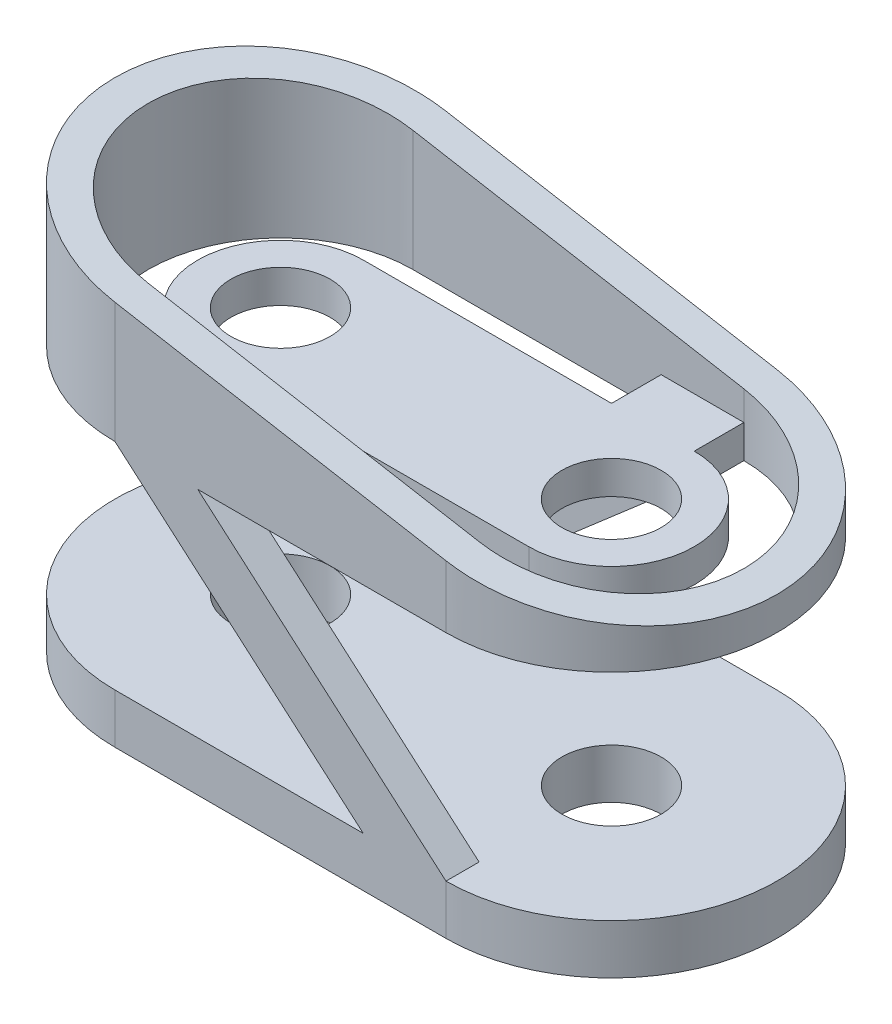
ISO-10303-21;
HEADER;
FILE_DESCRIPTION(('STEP AP214'),'2;1');
FILE_NAME('part.step','',(''),(''),'','','');
FILE_SCHEMA(('AUTOMOTIVE_DESIGN { 1 0 10303 214 1 1 1 1 }'));
ENDSEC;
DATA;
#1=APPLICATION_CONTEXT('core data for automotive mechanical design processes');
#2=APPLICATION_PROTOCOL_DEFINITION('international standard','automotive_design',2000,#1);
#3=PRODUCT_CONTEXT('',#1,'mechanical');
#4=PRODUCT('Part','Part','',(#3));
#5=PRODUCT_RELATED_PRODUCT_CATEGORY('part','',(#4));
#6=PRODUCT_DEFINITION_FORMATION('','',#4);
#7=PRODUCT_DEFINITION_CONTEXT('part definition',#1,'design');
#8=PRODUCT_DEFINITION('design','',#6,#7);
#9=PRODUCT_DEFINITION_SHAPE('','',#8);
#10=(LENGTH_UNIT() NAMED_UNIT(*) SI_UNIT(.MILLI.,.METRE.));
#11=(NAMED_UNIT(*) PLANE_ANGLE_UNIT() SI_UNIT($,.RADIAN.));
#12=(NAMED_UNIT(*) SI_UNIT($,.STERADIAN.) SOLID_ANGLE_UNIT());
#13=UNCERTAINTY_MEASURE_WITH_UNIT(LENGTH_MEASURE(1.E-05),#10,'distance_accuracy_value','');
#14=(GEOMETRIC_REPRESENTATION_CONTEXT(3) GLOBAL_UNCERTAINTY_ASSIGNED_CONTEXT((#13)) GLOBAL_UNIT_ASSIGNED_CONTEXT((#10,
#11,#12)) REPRESENTATION_CONTEXT('',''));
#15=CARTESIAN_POINT('',(0.,0.,0.));
#16=DIRECTION('',(0.,0.,1.));
#17=DIRECTION('',(1.,0.,0.));
#18=AXIS2_PLACEMENT_3D('',#15,#16,#17);
#19=CARTESIAN_POINT('',(-50.,80.,0.));
#20=DIRECTION('',(0.,1.,0.));
#21=DIRECTION('',(0.,0.,1.));
#22=AXIS2_PLACEMENT_3D('',#19,#20,#21);
#23=PLANE('',#22);
#24=CARTESIAN_POINT('',(-50.,80.,0.));
#25=DIRECTION('',(0.,-1.,0.));
#26=DIRECTION('',(0.,0.,-1.));
#27=AXIS2_PLACEMENT_3D('',#24,#25,#26);
#28=CIRCLE('',#27,40.);
#29=CARTESIAN_POINT('',(-50.,80.,40.));
#30=VERTEX_POINT('',#29);
#31=CARTESIAN_POINT('',(-50.,80.,-40.));
#32=VERTEX_POINT('',#31);
#33=EDGE_CURVE('E266',#30,#32,#28,.T.);
#34=ORIENTED_EDGE('',*,*,#33,.F.);
#35=DIRECTION('',(0.,0.,1.));
#36=VECTOR('',#35,1.);
#37=CARTESIAN_POINT('',(-50.,80.,40.));
#38=LINE('',#37,#36);
#39=CARTESIAN_POINT('',(-50.,80.,50.));
#40=VERTEX_POINT('',#39);
#41=EDGE_CURVE('E228',#30,#40,#38,.T.);
#42=ORIENTED_EDGE('',*,*,#41,.T.);
#43=CARTESIAN_POINT('',(-50.,80.,0.));
#44=DIRECTION('',(0.,1.,0.));
#45=DIRECTION('',(0.,0.,1.));
#46=AXIS2_PLACEMENT_3D('',#43,#44,#45);
#47=CIRCLE('',#46,50.);
#48=CARTESIAN_POINT('',(-50.,80.,-50.));
#49=VERTEX_POINT('',#48);
#50=EDGE_CURVE('E307',#49,#40,#47,.T.);
#51=ORIENTED_EDGE('',*,*,#50,.F.);
#52=DIRECTION('',(1.,0.,0.));
#53=VECTOR('',#52,1.);
#54=CARTESIAN_POINT('',(-50.,80.,-50.));
#55=LINE('',#54,#53);
#56=CARTESIAN_POINT('',(25.,80.,-50.));
#57=VERTEX_POINT('',#56);
#58=EDGE_CURVE('E314',#49,#57,#55,.T.);
#59=ORIENTED_EDGE('',*,*,#58,.T.);
#60=DIRECTION('',(0.,0.,-1.));
#61=VECTOR('',#60,1.);
#62=CARTESIAN_POINT('',(25.,80.,-40.));
#63=LINE('',#62,#61);
#64=CARTESIAN_POINT('',(25.,80.,-40.));
#65=VERTEX_POINT('',#64);
#66=EDGE_CURVE('E368',#65,#57,#63,.T.);
#67=ORIENTED_EDGE('',*,*,#66,.F.);
#68=DIRECTION('',(1.,0.,0.));
#69=VECTOR('',#68,1.);
#70=CARTESIAN_POINT('',(-50.,80.,-40.));
#71=LINE('',#70,#69);
#72=EDGE_CURVE('E286',#32,#65,#71,.T.);
#73=ORIENTED_EDGE('',*,*,#72,.F.);
#74=EDGE_LOOP('',(#34,#42,#51,#59,#67,#73));
#75=FACE_BOUND('',#74,.T.);
#76=ADVANCED_FACE('F33',(#75),#23,.F.);
#77=CARTESIAN_POINT('',(50.,80.,0.));
#78=DIRECTION('',(0.,-1.,0.));
#79=DIRECTION('',(0.,0.,-1.));
#80=AXIS2_PLACEMENT_3D('',#77,#78,#79);
#81=CIRCLE('',#80,15.);
#82=CARTESIAN_POINT('',(50.,80.,-15.));
#83=VERTEX_POINT('',#82);
#84=EDGE_CURVE('E490',#83,#83,#81,.T.);
#85=ORIENTED_EDGE('',*,*,#84,.F.);
#86=EDGE_LOOP('',(#85));
#87=FACE_BOUND('',#86,.T.);
#88=CARTESIAN_POINT('',(-50.,80.,0.));
#89=DIRECTION('',(0.,-1.,0.));
#90=DIRECTION('',(0.,0.,-1.));
#91=AXIS2_PLACEMENT_3D('',#88,#89,#90);
#92=CIRCLE('',#91,15.);
#93=CARTESIAN_POINT('',(-50.,80.,-15.));
#94=VERTEX_POINT('',#93);
#95=EDGE_CURVE('E484',#94,#94,#92,.T.);
#96=ORIENTED_EDGE('',*,*,#95,.F.);
#97=EDGE_LOOP('',(#96));
#98=FACE_BOUND('',#97,.T.);
#99=DIRECTION('',(-1.,0.,0.));
#100=VECTOR('',#99,1.);
#101=CARTESIAN_POINT('',(-25.,80.,40.));
#102=LINE('',#101,#100);
#103=CARTESIAN_POINT('',(-25.,80.,40.));
#104=VERTEX_POINT('',#103);
#105=EDGE_CURVE('E200',#104,#30,#102,.T.);
#106=ORIENTED_EDGE('',*,*,#105,.T.);
#107=DIRECTION('',(0.,0.,-1.));
#108=VECTOR('',#107,1.);
#109=CARTESIAN_POINT('',(-50.,80.,25.));
#110=LINE('',#109,#108);
#111=CARTESIAN_POINT('',(-50.,80.,25.));
#112=VERTEX_POINT('',#111);
#113=EDGE_CURVE('E256',#30,#112,#110,.T.);
#114=ORIENTED_EDGE('',*,*,#113,.T.);
#115=CARTESIAN_POINT('',(-50.,80.,0.));
#116=DIRECTION('',(0.,-1.,0.));
#117=DIRECTION('',(0.,0.,-1.));
#118=AXIS2_PLACEMENT_3D('',#115,#116,#117);
#119=CIRCLE('',#118,25.);
#120=CARTESIAN_POINT('',(-50.,80.,-25.));
#121=VERTEX_POINT('',#120);
#122=EDGE_CURVE('E457',#112,#121,#119,.T.);
#123=ORIENTED_EDGE('',*,*,#122,.T.);
#124=DIRECTION('',(1.,0.,0.));
#125=VECTOR('',#124,1.);
#126=CARTESIAN_POINT('',(-50.,80.,-25.));
#127=LINE('',#126,#125);
#128=CARTESIAN_POINT('',(25.,80.,-25.));
#129=VERTEX_POINT('',#128);
#130=EDGE_CURVE('E453',#121,#129,#127,.T.);
#131=ORIENTED_EDGE('',*,*,#130,.T.);
#132=DIRECTION('',(0.,0.,-1.));
#133=VECTOR('',#132,1.);
#134=CARTESIAN_POINT('',(25.,80.,-40.));
#135=LINE('',#134,#133);
#136=EDGE_CURVE('E442',#129,#65,#135,.T.);
#137=ORIENTED_EDGE('',*,*,#136,.T.);
#138=DIRECTION('',(1.,0.,0.));
#139=VECTOR('',#138,1.);
#140=CARTESIAN_POINT('',(25.,80.,-40.));
#141=LINE('',#140,#139);
#142=CARTESIAN_POINT('',(50.,80.,-40.));
#143=VERTEX_POINT('',#142);
#144=EDGE_CURVE('E351',#65,#143,#141,.T.);
#145=ORIENTED_EDGE('',*,*,#144,.T.);
#146=DIRECTION('',(0.,0.,1.));
#147=VECTOR('',#146,1.);
#148=CARTESIAN_POINT('',(50.,80.,-25.));
#149=LINE('',#148,#147);
#150=CARTESIAN_POINT('',(50.,80.,-25.));
#151=VERTEX_POINT('',#150);
#152=EDGE_CURVE('E439',#143,#151,#149,.T.);
#153=ORIENTED_EDGE('',*,*,#152,.T.);
#154=CARTESIAN_POINT('',(50.,80.,0.));
#155=DIRECTION('',(0.,-1.,0.));
#156=DIRECTION('',(0.,0.,-1.));
#157=AXIS2_PLACEMENT_3D('',#154,#155,#156);
#158=CIRCLE('',#157,25.);
#159=CARTESIAN_POINT('',(50.,80.,25.));
#160=VERTEX_POINT('',#159);
#161=EDGE_CURVE('E260',#151,#160,#158,.T.);
#162=ORIENTED_EDGE('',*,*,#161,.T.);
#163=DIRECTION('',(-1.,0.,0.));
#164=VECTOR('',#163,1.);
#165=CARTESIAN_POINT('',(-25.,80.,25.));
#166=LINE('',#165,#164);
#167=CARTESIAN_POINT('',(-25.,80.,25.));
#168=VERTEX_POINT('',#167);
#169=EDGE_CURVE('E255',#160,#168,#166,.T.);
#170=ORIENTED_EDGE('',*,*,#169,.T.);
#171=DIRECTION('',(0.,0.,1.));
#172=VECTOR('',#171,1.);
#173=CARTESIAN_POINT('',(-25.,80.,40.));
#174=LINE('',#173,#172);
#175=EDGE_CURVE('E245',#168,#104,#174,.T.);
#176=ORIENTED_EDGE('',*,*,#175,.T.);
#177=EDGE_LOOP('',(#106,#114,#123,#131,#137,#145,#153,#162,#170,#176));
#178=FACE_BOUND('',#177,.T.);
#179=ADVANCED_FACE('F252',(#87,#98,#178),#23,.F.);
#180=CARTESIAN_POINT('',(-50.,15.,0.));
#181=DIRECTION('',(0.,1.,0.));
#182=DIRECTION('',(0.,0.,1.));
#183=AXIS2_PLACEMENT_3D('',#180,#181,#182);
#184=PLANE('',#183);
#185=DIRECTION('',(0.,0.,1.));
#186=VECTOR('',#185,1.);
#187=CARTESIAN_POINT('',(25.,15.,40.));
#188=LINE('',#187,#186);
#189=CARTESIAN_POINT('',(25.,15.,40.));
#190=VERTEX_POINT('',#189);
#191=CARTESIAN_POINT('',(25.,15.,50.));
#192=VERTEX_POINT('',#191);
#193=EDGE_CURVE('E53',#190,#192,#188,.T.);
#194=ORIENTED_EDGE('',*,*,#193,.F.);
#195=DIRECTION('',(1.,0.,0.));
#196=VECTOR('',#195,1.);
#197=CARTESIAN_POINT('',(25.,15.,40.));
#198=LINE('',#197,#196);
#199=CARTESIAN_POINT('',(50.,15.,40.));
#200=VERTEX_POINT('',#199);
#201=EDGE_CURVE('E48',#190,#200,#198,.T.);
#202=ORIENTED_EDGE('',*,*,#201,.T.);
#203=DIRECTION('',(0.,0.,1.));
#204=VECTOR('',#203,1.);
#205=CARTESIAN_POINT('',(50.,15.,40.));
#206=LINE('',#205,#204);
#207=CARTESIAN_POINT('',(50.,15.,50.));
#208=VERTEX_POINT('',#207);
#209=EDGE_CURVE('E218',#200,#208,#206,.T.);
#210=ORIENTED_EDGE('',*,*,#209,.T.);
#211=CARTESIAN_POINT('',(50.,15.,0.));
#212=DIRECTION('',(0.,1.,0.));
#213=DIRECTION('',(0.,0.,1.));
#214=AXIS2_PLACEMENT_3D('',#211,#212,#213);
#215=CIRCLE('',#214,50.);
#216=CARTESIAN_POINT('',(50.,15.,-50.));
#217=VERTEX_POINT('',#216);
#218=EDGE_CURVE('E390',#208,#217,#215,.T.);
#219=ORIENTED_EDGE('',*,*,#218,.T.);
#220=DIRECTION('',(-1.,0.,0.));
#221=VECTOR('',#220,1.);
#222=CARTESIAN_POINT('',(-50.,15.,-50.));
#223=LINE('',#222,#221);
#224=CARTESIAN_POINT('',(-25.,15.,-50.));
#225=VERTEX_POINT('',#224);
#226=EDGE_CURVE('E392',#217,#225,#223,.T.);
#227=ORIENTED_EDGE('',*,*,#226,.T.);
#228=DIRECTION('',(0.,0.,-1.));
#229=VECTOR('',#228,1.);
#230=CARTESIAN_POINT('',(-25.,15.,-40.));
#231=LINE('',#230,#229);
#232=CARTESIAN_POINT('',(-25.,15.,-40.));
#233=VERTEX_POINT('',#232);
#234=EDGE_CURVE('E362',#233,#225,#231,.T.);
#235=ORIENTED_EDGE('',*,*,#234,.F.);
#236=DIRECTION('',(-1.,0.,0.));
#237=VECTOR('',#236,1.);
#238=CARTESIAN_POINT('',(-25.,15.,-40.));
#239=LINE('',#238,#237);
#240=CARTESIAN_POINT('',(-50.,15.,-40.));
#241=VERTEX_POINT('',#240);
#242=EDGE_CURVE('E344',#233,#241,#239,.T.);
#243=ORIENTED_EDGE('',*,*,#242,.T.);
#244=DIRECTION('',(0.,0.,-1.));
#245=VECTOR('',#244,1.);
#246=CARTESIAN_POINT('',(-50.,15.,-40.));
#247=LINE('',#246,#245);
#248=CARTESIAN_POINT('',(-50.,15.,-50.));
#249=VERTEX_POINT('',#248);
#250=EDGE_CURVE('E357',#241,#249,#247,.T.);
#251=ORIENTED_EDGE('',*,*,#250,.T.);
#252=CARTESIAN_POINT('',(-50.,15.,0.));
#253=DIRECTION('',(0.,1.,0.));
#254=DIRECTION('',(0.,0.,1.));
#255=AXIS2_PLACEMENT_3D('',#252,#253,#254);
#256=CIRCLE('',#255,50.);
#257=CARTESIAN_POINT('',(-50.,15.,50.));
#258=VERTEX_POINT('',#257);
#259=EDGE_CURVE('E384',#249,#258,#256,.T.);
#260=ORIENTED_EDGE('',*,*,#259,.T.);
#261=DIRECTION('',(1.,0.,0.));
#262=VECTOR('',#261,1.);
#263=CARTESIAN_POINT('',(-50.,15.,50.));
#264=LINE('',#263,#262);
#265=EDGE_CURVE('E387',#258,#192,#264,.T.);
#266=ORIENTED_EDGE('',*,*,#265,.T.);
#267=EDGE_LOOP('',(#194,#202,#210,#219,#227,#235,#243,#251,#260,#266));
#268=FACE_BOUND('',#267,.T.);
#269=CARTESIAN_POINT('',(-50.,15.,0.));
#270=DIRECTION('',(0.,1.,0.));
#271=DIRECTION('',(0.,0.,1.));
#272=AXIS2_PLACEMENT_3D('',#269,#270,#271);
#273=CIRCLE('',#272,15.);
#274=CARTESIAN_POINT('',(-50.,15.,15.));
#275=VERTEX_POINT('',#274);
#276=EDGE_CURVE('E378',#275,#275,#273,.T.);
#277=ORIENTED_EDGE('',*,*,#276,.F.);
#278=EDGE_LOOP('',(#277));
#279=FACE_BOUND('',#278,.T.);
#280=CARTESIAN_POINT('',(50.,15.,0.));
#281=DIRECTION('',(0.,1.,0.));
#282=DIRECTION('',(0.,0.,1.));
#283=AXIS2_PLACEMENT_3D('',#280,#281,#282);
#284=CIRCLE('',#283,15.);
#285=CARTESIAN_POINT('',(50.,15.,15.));
#286=VERTEX_POINT('',#285);
#287=EDGE_CURVE('E372',#286,#286,#284,.T.);
#288=ORIENTED_EDGE('',*,*,#287,.F.);
#289=EDGE_LOOP('',(#288));
#290=FACE_BOUND('',#289,.T.);
#291=ADVANCED_FACE('F426',(#268,#279,#290),#184,.T.);
#292=CARTESIAN_POINT('',(-50.,0.,0.));
#293=DIRECTION('',(0.,1.,0.));
#294=DIRECTION('',(0.,0.,1.));
#295=AXIS2_PLACEMENT_3D('',#292,#293,#294);
#296=PLANE('',#295);
#297=CARTESIAN_POINT('',(-50.,0.,0.));
#298=DIRECTION('',(0.,1.,0.));
#299=DIRECTION('',(0.,0.,1.));
#300=AXIS2_PLACEMENT_3D('',#297,#298,#299);
#301=CIRCLE('',#300,50.);
#302=CARTESIAN_POINT('',(-50.,0.,-50.));
#303=VERTEX_POINT('',#302);
#304=CARTESIAN_POINT('',(-50.,0.,50.));
#305=VERTEX_POINT('',#304);
#306=EDGE_CURVE('E381',#303,#305,#301,.T.);
#307=ORIENTED_EDGE('',*,*,#306,.F.);
#308=DIRECTION('',(-1.,0.,0.));
#309=VECTOR('',#308,1.);
#310=CARTESIAN_POINT('',(-50.,0.,-50.));
#311=LINE('',#310,#309);
#312=CARTESIAN_POINT('',(50.,0.,-50.));
#313=VERTEX_POINT('',#312);
#314=EDGE_CURVE('E388',#313,#303,#311,.T.);
#315=ORIENTED_EDGE('',*,*,#314,.F.);
#316=CARTESIAN_POINT('',(50.,0.,0.));
#317=DIRECTION('',(0.,1.,0.));
#318=DIRECTION('',(0.,0.,1.));
#319=AXIS2_PLACEMENT_3D('',#316,#317,#318);
#320=CIRCLE('',#319,50.);
#321=CARTESIAN_POINT('',(50.,0.,50.));
#322=VERTEX_POINT('',#321);
#323=EDGE_CURVE('E400',#322,#313,#320,.T.);
#324=ORIENTED_EDGE('',*,*,#323,.F.);
#325=DIRECTION('',(1.,0.,0.));
#326=VECTOR('',#325,1.);
#327=CARTESIAN_POINT('',(-50.,0.,50.));
#328=LINE('',#327,#326);
#329=EDGE_CURVE('E398',#305,#322,#328,.T.);
#330=ORIENTED_EDGE('',*,*,#329,.F.);
#331=EDGE_LOOP('',(#307,#315,#324,#330));
#332=FACE_BOUND('',#331,.T.);
#333=CARTESIAN_POINT('',(-50.,0.,0.));
#334=DIRECTION('',(0.,1.,0.));
#335=DIRECTION('',(0.,0.,1.));
#336=AXIS2_PLACEMENT_3D('',#333,#334,#335);
#337=CIRCLE('',#336,15.);
#338=CARTESIAN_POINT('',(-50.,0.,15.));
#339=VERTEX_POINT('',#338);
#340=EDGE_CURVE('E375',#339,#339,#337,.T.);
#341=ORIENTED_EDGE('',*,*,#340,.T.);
#342=EDGE_LOOP('',(#341));
#343=FACE_BOUND('',#342,.T.);
#344=CARTESIAN_POINT('',(50.,0.,0.));
#345=DIRECTION('',(0.,1.,0.));
#346=DIRECTION('',(0.,0.,1.));
#347=AXIS2_PLACEMENT_3D('',#344,#345,#346);
#348=CIRCLE('',#347,15.);
#349=CARTESIAN_POINT('',(50.,0.,15.));
#350=VERTEX_POINT('',#349);
#351=EDGE_CURVE('E364',#350,#350,#348,.T.);
#352=ORIENTED_EDGE('',*,*,#351,.T.);
#353=EDGE_LOOP('',(#352));
#354=FACE_BOUND('',#353,.T.);
#355=ADVANCED_FACE('F417',(#332,#343,#354),#296,.F.);
#356=CARTESIAN_POINT('',(-50.,15.,0.));
#357=DIRECTION('',(0.,-1.,0.));
#358=DIRECTION('',(0.,0.,-1.));
#359=AXIS2_PLACEMENT_3D('',#356,#357,#358);
#360=CYLINDRICAL_SURFACE('',#359,50.);
#361=ORIENTED_EDGE('',*,*,#306,.T.);
#362=DIRECTION('',(0.,-1.,0.));
#363=VECTOR('',#362,1.);
#364=CARTESIAN_POINT('',(-50.,15.,50.));
#365=LINE('',#364,#363);
#366=EDGE_CURVE('E11',#258,#305,#365,.T.);
#367=ORIENTED_EDGE('',*,*,#366,.F.);
#368=ORIENTED_EDGE('',*,*,#259,.F.);
#369=DIRECTION('',(0.,-1.,0.));
#370=VECTOR('',#369,1.);
#371=CARTESIAN_POINT('',(-50.,15.,-50.));
#372=LINE('',#371,#370);
#373=EDGE_CURVE('E395',#249,#303,#372,.T.);
#374=ORIENTED_EDGE('',*,*,#373,.T.);
#375=EDGE_LOOP('',(#361,#367,#368,#374));
#376=FACE_BOUND('',#375,.T.);
#377=ADVANCED_FACE('F35',(#376),#360,.T.);
#378=CARTESIAN_POINT('',(-50.,15.,50.));
#379=DIRECTION('',(0.,0.,-1.));
#380=DIRECTION('',(-1.,0.,0.));
#381=AXIS2_PLACEMENT_3D('',#378,#379,#380);
#382=PLANE('',#381);
#383=ORIENTED_EDGE('',*,*,#329,.T.);
#384=DIRECTION('',(0.,-1.,0.));
#385=VECTOR('',#384,1.);
#386=CARTESIAN_POINT('',(50.,15.,50.));
#387=LINE('',#386,#385);
#388=EDGE_CURVE('E41',#208,#322,#387,.T.);
#389=ORIENTED_EDGE('',*,*,#388,.F.);
#390=DIRECTION('',(-0.755689082789818,0.654930538417842,0.));
#391=VECTOR('',#390,1.);
#392=CARTESIAN_POINT('',(50.,15.,50.));
#393=LINE('',#392,#391);
#394=CARTESIAN_POINT('',(-25.,80.,50.));
#395=VERTEX_POINT('',#394);
#396=EDGE_CURVE('E502',#208,#395,#393,.T.);
#397=ORIENTED_EDGE('',*,*,#396,.T.);
#398=DIRECTION('',(1.,0.,0.));
#399=VECTOR('',#398,1.);
#400=CARTESIAN_POINT('',(-50.,80.,50.));
#401=LINE('',#400,#399);
#402=CARTESIAN_POINT('',(50.,80.,50.));
#403=VERTEX_POINT('',#402);
#404=EDGE_CURVE('E227',#395,#403,#401,.T.);
#405=ORIENTED_EDGE('',*,*,#404,.T.);
#406=DIRECTION('',(0.,-1.,0.));
#407=VECTOR('',#406,1.);
#408=CARTESIAN_POINT('',(50.,155.,50.));
#409=LINE('',#408,#407);
#410=CARTESIAN_POINT('',(50.,98.8163490354229,50.));
#411=VERTEX_POINT('',#410);
#412=EDGE_CURVE('E322',#411,#403,#409,.T.);
#413=ORIENTED_EDGE('',*,*,#412,.F.);
#414=DIRECTION('',(-0.984807753012209,0.173648177666923,0.));
#415=VECTOR('',#414,1.);
#416=CARTESIAN_POINT('',(-56.5926012170273,117.611500573882,50.));
#417=LINE('',#416,#415);
#418=CARTESIAN_POINT('',(-50.,116.449047106269,50.));
#419=VERTEX_POINT('',#418);
#420=EDGE_CURVE('E301',#411,#419,#417,.T.);
#421=ORIENTED_EDGE('',*,*,#420,.T.);
#422=DIRECTION('',(0.,-1.,0.));
#423=VECTOR('',#422,1.);
#424=CARTESIAN_POINT('',(-50.,155.,50.));
#425=LINE('',#424,#423);
#426=EDGE_CURVE('E325',#419,#40,#425,.T.);
#427=ORIENTED_EDGE('',*,*,#426,.T.);
#428=DIRECTION('',(0.755689082789818,-0.654930538417842,0.));
#429=VECTOR('',#428,1.);
#430=CARTESIAN_POINT('',(-50.,80.,50.));
#431=LINE('',#430,#429);
#432=EDGE_CURVE('E499',#40,#192,#431,.T.);
#433=ORIENTED_EDGE('',*,*,#432,.T.);
#434=ORIENTED_EDGE('',*,*,#265,.F.);
#435=ORIENTED_EDGE('',*,*,#366,.T.);
#436=EDGE_LOOP('',(#383,#389,#397,#405,#413,#421,#427,#433,#434,#435));
#437=FACE_BOUND('',#436,.T.);
#438=ADVANCED_FACE('F512',(#437),#382,.F.);
#439=CARTESIAN_POINT('',(50.,15.,0.));
#440=DIRECTION('',(0.,-1.,0.));
#441=DIRECTION('',(0.,0.,-1.));
#442=AXIS2_PLACEMENT_3D('',#439,#440,#441);
#443=CYLINDRICAL_SURFACE('',#442,50.);
#444=ORIENTED_EDGE('',*,*,#323,.T.);
#445=DIRECTION('',(0.,-1.,0.));
#446=VECTOR('',#445,1.);
#447=CARTESIAN_POINT('',(50.,15.,-50.));
#448=LINE('',#447,#446);
#449=EDGE_CURVE('E405',#217,#313,#448,.T.);
#450=ORIENTED_EDGE('',*,*,#449,.F.);
#451=ORIENTED_EDGE('',*,*,#218,.F.);
#452=ORIENTED_EDGE('',*,*,#388,.T.);
#453=EDGE_LOOP('',(#444,#450,#451,#452));
#454=FACE_BOUND('',#453,.T.);
#455=ADVANCED_FACE('F411',(#454),#443,.T.);
#456=CARTESIAN_POINT('',(-50.,15.,-50.));
#457=DIRECTION('',(0.,0.,1.));
#458=DIRECTION('',(1.,0.,0.));
#459=AXIS2_PLACEMENT_3D('',#456,#457,#458);
#460=PLANE('',#459);
#461=ORIENTED_EDGE('',*,*,#314,.T.);
#462=ORIENTED_EDGE('',*,*,#373,.F.);
#463=DIRECTION('',(0.755689082789818,0.654930538417842,0.));
#464=VECTOR('',#463,1.);
#465=CARTESIAN_POINT('',(-50.,15.,-50.));
#466=LINE('',#465,#464);
#467=EDGE_CURVE('E343',#249,#57,#466,.T.);
#468=ORIENTED_EDGE('',*,*,#467,.T.);
#469=ORIENTED_EDGE('',*,*,#58,.F.);
#470=DIRECTION('',(0.,-1.,0.));
#471=VECTOR('',#470,1.);
#472=CARTESIAN_POINT('',(-50.,155.,-50.));
#473=LINE('',#472,#471);
#474=CARTESIAN_POINT('',(-50.,116.449047106269,-50.));
#475=VERTEX_POINT('',#474);
#476=EDGE_CURVE('E317',#475,#49,#473,.T.);
#477=ORIENTED_EDGE('',*,*,#476,.F.);
#478=DIRECTION('',(-0.984807753012209,0.173648177666923,0.));
#479=VECTOR('',#478,1.);
#480=CARTESIAN_POINT('',(-56.5926012170273,117.611500573882,-50.));
#481=LINE('',#480,#479);
#482=CARTESIAN_POINT('',(50.,98.8163490354229,-50.));
#483=VERTEX_POINT('',#482);
#484=EDGE_CURVE('E328',#483,#475,#481,.T.);
#485=ORIENTED_EDGE('',*,*,#484,.F.);
#486=DIRECTION('',(0.,-1.,0.));
#487=VECTOR('',#486,1.);
#488=CARTESIAN_POINT('',(50.,155.,-50.));
#489=LINE('',#488,#487);
#490=CARTESIAN_POINT('',(50.,80.,-50.));
#491=VERTEX_POINT('',#490);
#492=EDGE_CURVE('E319',#483,#491,#489,.T.);
#493=ORIENTED_EDGE('',*,*,#492,.T.);
#494=DIRECTION('',(-0.755689082789818,-0.654930538417842,0.));
#495=VECTOR('',#494,1.);
#496=CARTESIAN_POINT('',(50.,80.,-50.));
#497=LINE('',#496,#495);
#498=EDGE_CURVE('E348',#491,#225,#497,.T.);
#499=ORIENTED_EDGE('',*,*,#498,.T.);
#500=ORIENTED_EDGE('',*,*,#226,.F.);
#501=ORIENTED_EDGE('',*,*,#449,.T.);
#502=EDGE_LOOP('',(#461,#462,#468,#469,#477,#485,#493,#499,#500,#501));
#503=FACE_BOUND('',#502,.T.);
#504=ADVANCED_FACE('F421',(#503),#460,.F.);
#505=CARTESIAN_POINT('',(-50.,15.,0.));
#506=DIRECTION('',(0.,-1.,0.));
#507=DIRECTION('',(0.,0.,-1.));
#508=AXIS2_PLACEMENT_3D('',#505,#506,#507);
#509=CYLINDRICAL_SURFACE('',#508,15.);
#510=ORIENTED_EDGE('',*,*,#276,.T.);
#511=EDGE_LOOP('',(#510));
#512=FACE_BOUND('',#511,.T.);
#513=ORIENTED_EDGE('',*,*,#340,.F.);
#514=EDGE_LOOP('',(#513));
#515=FACE_BOUND('',#514,.T.);
#516=ADVANCED_FACE('F561',(#512,#515),#509,.F.);
#517=CARTESIAN_POINT('',(50.,15.,0.));
#518=DIRECTION('',(0.,-1.,0.));
#519=DIRECTION('',(0.,0.,-1.));
#520=AXIS2_PLACEMENT_3D('',#517,#518,#519);
#521=CYLINDRICAL_SURFACE('',#520,15.);
#522=ORIENTED_EDGE('',*,*,#287,.T.);
#523=EDGE_LOOP('',(#522));
#524=FACE_BOUND('',#523,.T.);
#525=ORIENTED_EDGE('',*,*,#351,.F.);
#526=EDGE_LOOP('',(#525));
#527=FACE_BOUND('',#526,.T.);
#528=ADVANCED_FACE('F554',(#524,#527),#521,.F.);
#529=CARTESIAN_POINT('',(50.,80.,-40.));
#530=DIRECTION('',(0.654930538417842,-0.755689082789818,0.));
#531=DIRECTION('',(0.755689082789818,0.654930538417842,0.));
#532=AXIS2_PLACEMENT_3D('',#529,#530,#531);
#533=PLANE('',#532);
#534=ORIENTED_EDGE('',*,*,#498,.F.);
#535=DIRECTION('',(0.,0.,-1.));
#536=VECTOR('',#535,1.);
#537=CARTESIAN_POINT('',(50.,80.,-40.));
#538=LINE('',#537,#536);
#539=EDGE_CURVE('E365',#143,#491,#538,.T.);
#540=ORIENTED_EDGE('',*,*,#539,.F.);
#541=DIRECTION('',(-0.755689082789818,-0.654930538417842,0.));
#542=VECTOR('',#541,1.);
#543=CARTESIAN_POINT('',(50.,80.,-40.));
#544=LINE('',#543,#542);
#545=EDGE_CURVE('E354',#143,#233,#544,.T.);
#546=ORIENTED_EDGE('',*,*,#545,.T.);
#547=ORIENTED_EDGE('',*,*,#234,.T.);
#548=EDGE_LOOP('',(#534,#540,#546,#547));
#549=FACE_BOUND('',#548,.T.);
#550=ADVANCED_FACE('F552',(#549),#533,.T.);
#551=CARTESIAN_POINT('',(-50.,15.,-40.));
#552=DIRECTION('',(-0.654930538417842,0.755689082789818,0.));
#553=DIRECTION('',(-0.755689082789818,-0.654930538417842,0.));
#554=AXIS2_PLACEMENT_3D('',#551,#552,#553);
#555=PLANE('',#554);
#556=ORIENTED_EDGE('',*,*,#467,.F.);
#557=ORIENTED_EDGE('',*,*,#250,.F.);
#558=DIRECTION('',(0.755689082789818,0.654930538417842,0.));
#559=VECTOR('',#558,1.);
#560=CARTESIAN_POINT('',(-50.,15.,-40.));
#561=LINE('',#560,#559);
#562=EDGE_CURVE('E347',#241,#65,#561,.T.);
#563=ORIENTED_EDGE('',*,*,#562,.T.);
#564=ORIENTED_EDGE('',*,*,#66,.T.);
#565=EDGE_LOOP('',(#556,#557,#563,#564));
#566=FACE_BOUND('',#565,.T.);
#567=ADVANCED_FACE('F431',(#566),#555,.T.);
#568=CARTESIAN_POINT('',(0.,0.,-40.));
#569=DIRECTION('',(0.,0.,-1.));
#570=DIRECTION('',(0.,1.,0.));
#571=AXIS2_PLACEMENT_3D('',#568,#569,#570);
#572=PLANE('',#571);
#573=ORIENTED_EDGE('',*,*,#242,.F.);
#574=ORIENTED_EDGE('',*,*,#545,.F.);
#575=ORIENTED_EDGE('',*,*,#144,.F.);
#576=ORIENTED_EDGE('',*,*,#562,.F.);
#577=EDGE_LOOP('',(#573,#574,#575,#576));
#578=FACE_BOUND('',#577,.T.);
#579=ADVANCED_FACE('F434',(#578),#572,.F.);
#580=ORIENTED_EDGE('',*,*,#404,.F.);
#581=DIRECTION('',(0.,0.,1.));
#582=VECTOR('',#581,1.);
#583=CARTESIAN_POINT('',(-25.,80.,40.));
#584=LINE('',#583,#582);
#585=EDGE_CURVE('E216',#104,#395,#584,.T.);
#586=ORIENTED_EDGE('',*,*,#585,.F.);
#587=DIRECTION('',(-1.,0.,0.));
#588=VECTOR('',#587,1.);
#589=CARTESIAN_POINT('',(50.,80.,40.));
#590=LINE('',#589,#588);
#591=CARTESIAN_POINT('',(50.,80.,40.));
#592=VERTEX_POINT('',#591);
#593=EDGE_CURVE('E225',#592,#104,#590,.T.);
#594=ORIENTED_EDGE('',*,*,#593,.F.);
#595=CARTESIAN_POINT('',(50.,80.,0.));
#596=DIRECTION('',(0.,-1.,0.));
#597=DIRECTION('',(0.,0.,-1.));
#598=AXIS2_PLACEMENT_3D('',#595,#596,#597);
#599=CIRCLE('',#598,40.);
#600=EDGE_CURVE('E239',#143,#592,#599,.T.);
#601=ORIENTED_EDGE('',*,*,#600,.F.);
#602=ORIENTED_EDGE('',*,*,#539,.T.);
#603=CARTESIAN_POINT('',(50.,80.,0.));
#604=DIRECTION('',(0.,1.,0.));
#605=DIRECTION('',(0.,0.,1.));
#606=AXIS2_PLACEMENT_3D('',#603,#604,#605);
#607=CIRCLE('',#606,50.);
#608=EDGE_CURVE('E311',#403,#491,#607,.T.);
#609=ORIENTED_EDGE('',*,*,#608,.F.);
#610=EDGE_LOOP('',(#580,#586,#594,#601,#602,#609));
#611=FACE_BOUND('',#610,.T.);
#612=ADVANCED_FACE('F223',(#611),#23,.F.);
#613=CARTESIAN_POINT('',(-50.,155.,0.));
#614=DIRECTION('',(0.,-1.,0.));
#615=DIRECTION('',(0.,0.,-1.));
#616=AXIS2_PLACEMENT_3D('',#613,#614,#615);
#617=CYLINDRICAL_SURFACE('',#616,50.);
#618=ORIENTED_EDGE('',*,*,#426,.F.);
#619=CARTESIAN_POINT('',(-50.,116.449047106269,0.));
#620=DIRECTION('',(-0.173648177666923,-0.984807753012209,0.));
#621=DIRECTION('',(0.984807753012209,-0.173648177666923,0.));
#622=AXIS2_PLACEMENT_3D('',#619,#620,#621);
#623=ELLIPSE('',#622,50.7713305942872,50.);
#624=EDGE_CURVE('E304',#419,#475,#623,.T.);
#625=ORIENTED_EDGE('',*,*,#624,.T.);
#626=ORIENTED_EDGE('',*,*,#476,.T.);
#627=ORIENTED_EDGE('',*,*,#50,.T.);
#628=EDGE_LOOP('',(#618,#625,#626,#627));
#629=FACE_BOUND('',#628,.T.);
#630=ADVANCED_FACE('F516',(#629),#617,.T.);
#631=CARTESIAN_POINT('',(50.,155.,0.));
#632=DIRECTION('',(0.,-1.,0.));
#633=DIRECTION('',(0.,0.,-1.));
#634=AXIS2_PLACEMENT_3D('',#631,#632,#633);
#635=CYLINDRICAL_SURFACE('',#634,50.);
#636=CARTESIAN_POINT('',(50.,98.8163490354229,0.));
#637=DIRECTION('',(-0.173648177666923,-0.984807753012209,0.));
#638=DIRECTION('',(0.984807753012209,-0.173648177666923,0.));
#639=AXIS2_PLACEMENT_3D('',#636,#637,#638);
#640=ELLIPSE('',#639,50.7713305942872,50.);
#641=EDGE_CURVE('E293',#483,#411,#640,.T.);
#642=ORIENTED_EDGE('',*,*,#641,.T.);
#643=ORIENTED_EDGE('',*,*,#412,.T.);
#644=ORIENTED_EDGE('',*,*,#608,.T.);
#645=ORIENTED_EDGE('',*,*,#492,.F.);
#646=EDGE_LOOP('',(#642,#643,#644,#645));
#647=FACE_BOUND('',#646,.T.);
#648=ADVANCED_FACE('F547',(#647),#635,.T.);
#649=CARTESIAN_POINT('',(100.,90.,402.59419651032));
#650=DIRECTION('',(-0.173648177666923,-0.984807753012209,0.));
#651=DIRECTION('',(0.984807753012209,-0.173648177666923,0.));
#652=AXIS2_PLACEMENT_3D('',#649,#650,#651);
#653=PLANE('',#652);
#654=DIRECTION('',(-0.984807753012209,0.173648177666923,0.));
#655=VECTOR('',#654,1.);
#656=CARTESIAN_POINT('',(100.,90.,40.));
#657=LINE('',#656,#655);
#658=CARTESIAN_POINT('',(50.,98.8163490354229,40.));
#659=VERTEX_POINT('',#658);
#660=CARTESIAN_POINT('',(-50.,116.449047106269,40.));
#661=VERTEX_POINT('',#660);
#662=EDGE_CURVE('E337',#659,#661,#657,.T.);
#663=ORIENTED_EDGE('',*,*,#662,.T.);
#664=CARTESIAN_POINT('',(-50.,116.449047106269,0.));
#665=DIRECTION('',(-0.173648177666923,-0.984807753012209,0.));
#666=DIRECTION('',(0.984807753012209,-0.173648177666923,0.));
#667=AXIS2_PLACEMENT_3D('',#664,#665,#666);
#668=ELLIPSE('',#667,40.6170644754298,40.);
#669=CARTESIAN_POINT('',(-50.,116.449047106269,-40.));
#670=VERTEX_POINT('',#669);
#671=EDGE_CURVE('E340',#661,#670,#668,.T.);
#672=ORIENTED_EDGE('',*,*,#671,.T.);
#673=DIRECTION('',(0.984807753012209,-0.173648177666923,0.));
#674=VECTOR('',#673,1.);
#675=CARTESIAN_POINT('',(100.,90.,-40.));
#676=LINE('',#675,#674);
#677=CARTESIAN_POINT('',(50.,98.8163490354229,-40.));
#678=VERTEX_POINT('',#677);
#679=EDGE_CURVE('E331',#670,#678,#676,.T.);
#680=ORIENTED_EDGE('',*,*,#679,.T.);
#681=CARTESIAN_POINT('',(50.,98.8163490354229,0.));
#682=DIRECTION('',(-0.173648177666923,-0.984807753012209,0.));
#683=DIRECTION('',(0.984807753012209,-0.173648177666923,0.));
#684=AXIS2_PLACEMENT_3D('',#681,#682,#683);
#685=ELLIPSE('',#684,40.6170644754297,40.);
#686=EDGE_CURVE('E334',#678,#659,#685,.T.);
#687=ORIENTED_EDGE('',*,*,#686,.T.);
#688=EDGE_LOOP('',(#663,#672,#680,#687));
#689=FACE_BOUND('',#688,.T.);
#690=ORIENTED_EDGE('',*,*,#624,.F.);
#691=ORIENTED_EDGE('',*,*,#420,.F.);
#692=ORIENTED_EDGE('',*,*,#641,.F.);
#693=ORIENTED_EDGE('',*,*,#484,.T.);
#694=EDGE_LOOP('',(#690,#691,#692,#693));
#695=FACE_BOUND('',#694,.T.);
#696=ADVANCED_FACE('F544',(#689,#695),#653,.F.);
#697=CARTESIAN_POINT('',(-50.,155.,0.));
#698=DIRECTION('',(0.,-1.,0.));
#699=DIRECTION('',(0.,0.,-1.));
#700=AXIS2_PLACEMENT_3D('',#697,#698,#699);
#701=CYLINDRICAL_SURFACE('',#700,40.);
#702=DIRECTION('',(0.,-1.,0.));
#703=VECTOR('',#702,1.);
#704=CARTESIAN_POINT('',(-50.,155.,40.));
#705=LINE('',#704,#703);
#706=CARTESIAN_POINT('',(-50.,90.,40.));
#707=VERTEX_POINT('',#706);
#708=EDGE_CURVE('E290',#661,#707,#705,.T.);
#709=ORIENTED_EDGE('',*,*,#708,.T.);
#710=DIRECTION('',(0.,-1.,0.));
#711=VECTOR('',#710,1.);
#712=CARTESIAN_POINT('',(-50.,90.,40.));
#713=LINE('',#712,#711);
#714=EDGE_CURVE('E249',#707,#30,#713,.T.);
#715=ORIENTED_EDGE('',*,*,#714,.T.);
#716=ORIENTED_EDGE('',*,*,#33,.T.);
#717=DIRECTION('',(0.,-1.,0.));
#718=VECTOR('',#717,1.);
#719=CARTESIAN_POINT('',(-50.,155.,-40.));
#720=LINE('',#719,#718);
#721=EDGE_CURVE('E238',#670,#32,#720,.T.);
#722=ORIENTED_EDGE('',*,*,#721,.F.);
#723=ORIENTED_EDGE('',*,*,#671,.F.);
#724=EDGE_LOOP('',(#709,#715,#716,#722,#723));
#725=FACE_BOUND('',#724,.T.);
#726=ADVANCED_FACE('F541',(#725),#701,.F.);
#727=CARTESIAN_POINT('',(50.,155.,40.));
#728=DIRECTION('',(0.,0.,1.));
#729=DIRECTION('',(1.,0.,0.));
#730=AXIS2_PLACEMENT_3D('',#727,#728,#729);
#731=PLANE('',#730);
#732=ORIENTED_EDGE('',*,*,#593,.T.);
#733=DIRECTION('',(0.,-1.,0.));
#734=VECTOR('',#733,1.);
#735=CARTESIAN_POINT('',(-25.,90.,40.));
#736=LINE('',#735,#734);
#737=CARTESIAN_POINT('',(-25.,90.,40.));
#738=VERTEX_POINT('',#737);
#739=EDGE_CURVE('E233',#738,#104,#736,.T.);
#740=ORIENTED_EDGE('',*,*,#739,.F.);
#741=DIRECTION('',(-1.,0.,0.));
#742=VECTOR('',#741,1.);
#743=CARTESIAN_POINT('',(-50.,90.,40.));
#744=LINE('',#743,#742);
#745=EDGE_CURVE('E463',#738,#707,#744,.T.);
#746=ORIENTED_EDGE('',*,*,#745,.T.);
#747=ORIENTED_EDGE('',*,*,#708,.F.);
#748=ORIENTED_EDGE('',*,*,#662,.F.);
#749=DIRECTION('',(0.,-1.,0.));
#750=VECTOR('',#749,1.);
#751=CARTESIAN_POINT('',(50.,155.,40.));
#752=LINE('',#751,#750);
#753=EDGE_CURVE('E236',#659,#592,#752,.T.);
#754=ORIENTED_EDGE('',*,*,#753,.T.);
#755=EDGE_LOOP('',(#732,#740,#746,#747,#748,#754));
#756=FACE_BOUND('',#755,.T.);
#757=ADVANCED_FACE('F232',(#756),#731,.F.);
#758=CARTESIAN_POINT('',(50.,155.,0.));
#759=DIRECTION('',(0.,-1.,0.));
#760=DIRECTION('',(0.,0.,-1.));
#761=AXIS2_PLACEMENT_3D('',#758,#759,#760);
#762=CYLINDRICAL_SURFACE('',#761,40.);
#763=DIRECTION('',(0.,-1.,0.));
#764=VECTOR('',#763,1.);
#765=CARTESIAN_POINT('',(50.,155.,-40.));
#766=LINE('',#765,#764);
#767=CARTESIAN_POINT('',(50.,90.,-40.));
#768=VERTEX_POINT('',#767);
#769=EDGE_CURVE('E295',#678,#768,#766,.T.);
#770=ORIENTED_EDGE('',*,*,#769,.T.);
#771=DIRECTION('',(0.,-1.,0.));
#772=VECTOR('',#771,1.);
#773=CARTESIAN_POINT('',(50.,90.,-40.));
#774=LINE('',#773,#772);
#775=EDGE_CURVE('E274',#768,#143,#774,.T.);
#776=ORIENTED_EDGE('',*,*,#775,.T.);
#777=ORIENTED_EDGE('',*,*,#600,.T.);
#778=ORIENTED_EDGE('',*,*,#753,.F.);
#779=ORIENTED_EDGE('',*,*,#686,.F.);
#780=EDGE_LOOP('',(#770,#776,#777,#778,#779));
#781=FACE_BOUND('',#780,.T.);
#782=ADVANCED_FACE('F445',(#781),#762,.F.);
#783=CARTESIAN_POINT('',(-50.,155.,-40.));
#784=DIRECTION('',(0.,0.,-1.));
#785=DIRECTION('',(-1.,0.,0.));
#786=AXIS2_PLACEMENT_3D('',#783,#784,#785);
#787=PLANE('',#786);
#788=ORIENTED_EDGE('',*,*,#72,.T.);
#789=DIRECTION('',(0.,-1.,0.));
#790=VECTOR('',#789,1.);
#791=CARTESIAN_POINT('',(25.,90.,-40.));
#792=LINE('',#791,#790);
#793=CARTESIAN_POINT('',(25.,90.,-40.));
#794=VERTEX_POINT('',#793);
#795=EDGE_CURVE('E277',#794,#65,#792,.T.);
#796=ORIENTED_EDGE('',*,*,#795,.F.);
#797=DIRECTION('',(1.,0.,0.));
#798=VECTOR('',#797,1.);
#799=CARTESIAN_POINT('',(50.,90.,-40.));
#800=LINE('',#799,#798);
#801=EDGE_CURVE('E474',#794,#768,#800,.T.);
#802=ORIENTED_EDGE('',*,*,#801,.T.);
#803=ORIENTED_EDGE('',*,*,#769,.F.);
#804=ORIENTED_EDGE('',*,*,#679,.F.);
#805=ORIENTED_EDGE('',*,*,#721,.T.);
#806=EDGE_LOOP('',(#788,#796,#802,#803,#804,#805));
#807=FACE_BOUND('',#806,.T.);
#808=ADVANCED_FACE('F519',(#807),#787,.F.);
#809=CARTESIAN_POINT('',(-50.,90.,0.));
#810=DIRECTION('',(0.,-1.,0.));
#811=DIRECTION('',(0.,0.,-1.));
#812=AXIS2_PLACEMENT_3D('',#809,#810,#811);
#813=CYLINDRICAL_SURFACE('',#812,25.);
#814=ORIENTED_EDGE('',*,*,#122,.F.);
#815=DIRECTION('',(0.,-1.,0.));
#816=VECTOR('',#815,1.);
#817=CARTESIAN_POINT('',(-50.,90.,25.));
#818=LINE('',#817,#816);
#819=CARTESIAN_POINT('',(-50.,90.,25.));
#820=VERTEX_POINT('',#819);
#821=EDGE_CURVE('E264',#820,#112,#818,.T.);
#822=ORIENTED_EDGE('',*,*,#821,.F.);
#823=CARTESIAN_POINT('',(-50.,90.,0.));
#824=DIRECTION('',(0.,-1.,0.));
#825=DIRECTION('',(0.,0.,-1.));
#826=AXIS2_PLACEMENT_3D('',#823,#824,#825);
#827=CIRCLE('',#826,25.);
#828=CARTESIAN_POINT('',(-50.,90.,-25.));
#829=VERTEX_POINT('',#828);
#830=EDGE_CURVE('E258',#820,#829,#827,.T.);
#831=ORIENTED_EDGE('',*,*,#830,.T.);
#832=DIRECTION('',(0.,-1.,0.));
#833=VECTOR('',#832,1.);
#834=CARTESIAN_POINT('',(-50.,90.,-25.));
#835=LINE('',#834,#833);
#836=EDGE_CURVE('E282',#829,#121,#835,.T.);
#837=ORIENTED_EDGE('',*,*,#836,.T.);
#838=EDGE_LOOP('',(#814,#822,#831,#837));
#839=FACE_BOUND('',#838,.T.);
#840=ADVANCED_FACE('F534',(#839),#813,.T.);
#841=CARTESIAN_POINT('',(-50.,90.,25.));
#842=DIRECTION('',(-1.,0.,0.));
#843=DIRECTION('',(0.,0.,1.));
#844=AXIS2_PLACEMENT_3D('',#841,#842,#843);
#845=PLANE('',#844);
#846=ORIENTED_EDGE('',*,*,#113,.F.);
#847=ORIENTED_EDGE('',*,*,#714,.F.);
#848=DIRECTION('',(0.,0.,-1.));
#849=VECTOR('',#848,1.);
#850=CARTESIAN_POINT('',(-50.,90.,25.));
#851=LINE('',#850,#849);
#852=EDGE_CURVE('E284',#707,#820,#851,.T.);
#853=ORIENTED_EDGE('',*,*,#852,.T.);
#854=ORIENTED_EDGE('',*,*,#821,.T.);
#855=EDGE_LOOP('',(#846,#847,#853,#854));
#856=FACE_BOUND('',#855,.T.);
#857=ADVANCED_FACE('F539',(#856),#845,.T.);
#858=CARTESIAN_POINT('',(-25.,90.,40.));
#859=DIRECTION('',(1.,0.,0.));
#860=DIRECTION('',(0.,0.,-1.));
#861=AXIS2_PLACEMENT_3D('',#858,#859,#860);
#862=PLANE('',#861);
#863=ORIENTED_EDGE('',*,*,#175,.F.);
#864=DIRECTION('',(0.,-1.,0.));
#865=VECTOR('',#864,1.);
#866=CARTESIAN_POINT('',(-25.,90.,25.));
#867=LINE('',#866,#865);
#868=CARTESIAN_POINT('',(-25.,90.,25.));
#869=VERTEX_POINT('',#868);
#870=EDGE_CURVE('E250',#869,#168,#867,.T.);
#871=ORIENTED_EDGE('',*,*,#870,.F.);
#872=DIRECTION('',(0.,0.,1.));
#873=VECTOR('',#872,1.);
#874=CARTESIAN_POINT('',(-25.,90.,40.));
#875=LINE('',#874,#873);
#876=EDGE_CURVE('E248',#869,#738,#875,.T.);
#877=ORIENTED_EDGE('',*,*,#876,.T.);
#878=ORIENTED_EDGE('',*,*,#739,.T.);
#879=EDGE_LOOP('',(#863,#871,#877,#878));
#880=FACE_BOUND('',#879,.T.);
#881=ADVANCED_FACE('F244',(#880),#862,.T.);
#882=CARTESIAN_POINT('',(-25.,90.,25.));
#883=DIRECTION('',(0.,0.,1.));
#884=DIRECTION('',(1.,0.,0.));
#885=AXIS2_PLACEMENT_3D('',#882,#883,#884);
#886=PLANE('',#885);
#887=ORIENTED_EDGE('',*,*,#169,.F.);
#888=DIRECTION('',(0.,-1.,0.));
#889=VECTOR('',#888,1.);
#890=CARTESIAN_POINT('',(50.,90.,25.));
#891=LINE('',#890,#889);
#892=CARTESIAN_POINT('',(50.,90.,25.));
#893=VERTEX_POINT('',#892);
#894=EDGE_CURVE('E270',#893,#160,#891,.T.);
#895=ORIENTED_EDGE('',*,*,#894,.F.);
#896=DIRECTION('',(-1.,0.,0.));
#897=VECTOR('',#896,1.);
#898=CARTESIAN_POINT('',(-25.,90.,25.));
#899=LINE('',#898,#897);
#900=EDGE_CURVE('E466',#893,#869,#899,.T.);
#901=ORIENTED_EDGE('',*,*,#900,.T.);
#902=ORIENTED_EDGE('',*,*,#870,.T.);
#903=EDGE_LOOP('',(#887,#895,#901,#902));
#904=FACE_BOUND('',#903,.T.);
#905=ADVANCED_FACE('F632',(#904),#886,.T.);
#906=CARTESIAN_POINT('',(50.,90.,0.));
#907=DIRECTION('',(0.,-1.,0.));
#908=DIRECTION('',(0.,0.,-1.));
#909=AXIS2_PLACEMENT_3D('',#906,#907,#908);
#910=CYLINDRICAL_SURFACE('',#909,25.);
#911=ORIENTED_EDGE('',*,*,#161,.F.);
#912=DIRECTION('',(0.,-1.,0.));
#913=VECTOR('',#912,1.);
#914=CARTESIAN_POINT('',(50.,90.,-25.));
#915=LINE('',#914,#913);
#916=CARTESIAN_POINT('',(50.,90.,-25.));
#917=VERTEX_POINT('',#916);
#918=EDGE_CURVE('E272',#917,#151,#915,.T.);
#919=ORIENTED_EDGE('',*,*,#918,.F.);
#920=CARTESIAN_POINT('',(50.,90.,0.));
#921=DIRECTION('',(0.,-1.,0.));
#922=DIRECTION('',(0.,0.,-1.));
#923=AXIS2_PLACEMENT_3D('',#920,#921,#922);
#924=CIRCLE('',#923,25.);
#925=EDGE_CURVE('E469',#917,#893,#924,.T.);
#926=ORIENTED_EDGE('',*,*,#925,.T.);
#927=ORIENTED_EDGE('',*,*,#894,.T.);
#928=EDGE_LOOP('',(#911,#919,#926,#927));
#929=FACE_BOUND('',#928,.T.);
#930=ADVANCED_FACE('F639',(#929),#910,.T.);
#931=CARTESIAN_POINT('',(50.,90.,-25.));
#932=DIRECTION('',(1.,0.,0.));
#933=DIRECTION('',(0.,0.,-1.));
#934=AXIS2_PLACEMENT_3D('',#931,#932,#933);
#935=PLANE('',#934);
#936=ORIENTED_EDGE('',*,*,#152,.F.);
#937=ORIENTED_EDGE('',*,*,#775,.F.);
#938=DIRECTION('',(0.,0.,1.));
#939=VECTOR('',#938,1.);
#940=CARTESIAN_POINT('',(50.,90.,-25.));
#941=LINE('',#940,#939);
#942=EDGE_CURVE('E472',#768,#917,#941,.T.);
#943=ORIENTED_EDGE('',*,*,#942,.T.);
#944=ORIENTED_EDGE('',*,*,#918,.T.);
#945=EDGE_LOOP('',(#936,#937,#943,#944));
#946=FACE_BOUND('',#945,.T.);
#947=ADVANCED_FACE('F450',(#946),#935,.T.);
#948=CARTESIAN_POINT('',(25.,90.,-40.));
#949=DIRECTION('',(-1.,0.,0.));
#950=DIRECTION('',(0.,0.,1.));
#951=AXIS2_PLACEMENT_3D('',#948,#949,#950);
#952=PLANE('',#951);
#953=ORIENTED_EDGE('',*,*,#136,.F.);
#954=DIRECTION('',(0.,-1.,0.));
#955=VECTOR('',#954,1.);
#956=CARTESIAN_POINT('',(25.,90.,-25.));
#957=LINE('',#956,#955);
#958=CARTESIAN_POINT('',(25.,90.,-25.));
#959=VERTEX_POINT('',#958);
#960=EDGE_CURVE('E280',#959,#129,#957,.T.);
#961=ORIENTED_EDGE('',*,*,#960,.F.);
#962=DIRECTION('',(0.,0.,-1.));
#963=VECTOR('',#962,1.);
#964=CARTESIAN_POINT('',(25.,90.,-40.));
#965=LINE('',#964,#963);
#966=EDGE_CURVE('E476',#959,#794,#965,.T.);
#967=ORIENTED_EDGE('',*,*,#966,.T.);
#968=ORIENTED_EDGE('',*,*,#795,.T.);
#969=EDGE_LOOP('',(#953,#961,#967,#968));
#970=FACE_BOUND('',#969,.T.);
#971=ADVANCED_FACE('F523',(#970),#952,.T.);
#972=CARTESIAN_POINT('',(-50.,90.,-25.));
#973=DIRECTION('',(0.,0.,-1.));
#974=DIRECTION('',(-1.,0.,0.));
#975=AXIS2_PLACEMENT_3D('',#972,#973,#974);
#976=PLANE('',#975);
#977=ORIENTED_EDGE('',*,*,#130,.F.);
#978=ORIENTED_EDGE('',*,*,#836,.F.);
#979=DIRECTION('',(1.,0.,0.));
#980=VECTOR('',#979,1.);
#981=CARTESIAN_POINT('',(-50.,90.,-25.));
#982=LINE('',#981,#980);
#983=EDGE_CURVE('E479',#829,#959,#982,.T.);
#984=ORIENTED_EDGE('',*,*,#983,.T.);
#985=ORIENTED_EDGE('',*,*,#960,.T.);
#986=EDGE_LOOP('',(#977,#978,#984,#985));
#987=FACE_BOUND('',#986,.T.);
#988=ADVANCED_FACE('F531',(#987),#976,.T.);
#989=CARTESIAN_POINT('',(-50.,90.,0.));
#990=DIRECTION('',(0.,-1.,0.));
#991=DIRECTION('',(0.,0.,-1.));
#992=AXIS2_PLACEMENT_3D('',#989,#990,#991);
#993=PLANE('',#992);
#994=CARTESIAN_POINT('',(50.,90.,0.));
#995=DIRECTION('',(0.,-1.,0.));
#996=DIRECTION('',(0.,0.,-1.));
#997=AXIS2_PLACEMENT_3D('',#994,#995,#996);
#998=CIRCLE('',#997,15.);
#999=CARTESIAN_POINT('',(50.,90.,-15.));
#1000=VERTEX_POINT('',#999);
#1001=EDGE_CURVE('E487',#1000,#1000,#998,.T.);
#1002=ORIENTED_EDGE('',*,*,#1001,.T.);
#1003=EDGE_LOOP('',(#1002));
#1004=FACE_BOUND('',#1003,.T.);
#1005=CARTESIAN_POINT('',(-50.,90.,0.));
#1006=DIRECTION('',(0.,-1.,0.));
#1007=DIRECTION('',(0.,0.,-1.));
#1008=AXIS2_PLACEMENT_3D('',#1005,#1006,#1007);
#1009=CIRCLE('',#1008,15.);
#1010=CARTESIAN_POINT('',(-50.,90.,-15.));
#1011=VERTEX_POINT('',#1010);
#1012=EDGE_CURVE('E460',#1011,#1011,#1009,.T.);
#1013=ORIENTED_EDGE('',*,*,#1012,.T.);
#1014=EDGE_LOOP('',(#1013));
#1015=FACE_BOUND('',#1014,.T.);
#1016=ORIENTED_EDGE('',*,*,#830,.F.);
#1017=ORIENTED_EDGE('',*,*,#852,.F.);
#1018=ORIENTED_EDGE('',*,*,#745,.F.);
#1019=ORIENTED_EDGE('',*,*,#876,.F.);
#1020=ORIENTED_EDGE('',*,*,#900,.F.);
#1021=ORIENTED_EDGE('',*,*,#925,.F.);
#1022=ORIENTED_EDGE('',*,*,#942,.F.);
#1023=ORIENTED_EDGE('',*,*,#801,.F.);
#1024=ORIENTED_EDGE('',*,*,#966,.F.);
#1025=ORIENTED_EDGE('',*,*,#983,.F.);
#1026=EDGE_LOOP('',(#1016,#1017,#1018,#1019,#1020,#1021,#1022,#1023,#1024,#1025));
#1027=FACE_BOUND('',#1026,.T.);
#1028=ADVANCED_FACE('F528',(#1004,#1015,#1027),#993,.F.);
#1029=CARTESIAN_POINT('',(-50.,90.,0.));
#1030=DIRECTION('',(0.,-1.,0.));
#1031=DIRECTION('',(0.,0.,-1.));
#1032=AXIS2_PLACEMENT_3D('',#1029,#1030,#1031);
#1033=CYLINDRICAL_SURFACE('',#1032,15.);
#1034=ORIENTED_EDGE('',*,*,#1012,.F.);
#1035=EDGE_LOOP('',(#1034));
#1036=FACE_BOUND('',#1035,.T.);
#1037=ORIENTED_EDGE('',*,*,#95,.T.);
#1038=EDGE_LOOP('',(#1037));
#1039=FACE_BOUND('',#1038,.T.);
#1040=ADVANCED_FACE('F672',(#1036,#1039),#1033,.F.);
#1041=CARTESIAN_POINT('',(50.,90.,0.));
#1042=DIRECTION('',(0.,-1.,0.));
#1043=DIRECTION('',(0.,0.,-1.));
#1044=AXIS2_PLACEMENT_3D('',#1041,#1042,#1043);
#1045=CYLINDRICAL_SURFACE('',#1044,15.);
#1046=ORIENTED_EDGE('',*,*,#1001,.F.);
#1047=EDGE_LOOP('',(#1046));
#1048=FACE_BOUND('',#1047,.T.);
#1049=ORIENTED_EDGE('',*,*,#84,.T.);
#1050=EDGE_LOOP('',(#1049));
#1051=FACE_BOUND('',#1050,.T.);
#1052=ADVANCED_FACE('F680',(#1048,#1051),#1045,.F.);
#1053=CARTESIAN_POINT('',(-50.,80.,40.));
#1054=DIRECTION('',(-0.654930538417842,-0.755689082789818,0.));
#1055=DIRECTION('',(0.755689082789818,-0.654930538417842,0.));
#1056=AXIS2_PLACEMENT_3D('',#1053,#1054,#1055);
#1057=PLANE('',#1056);
#1058=ORIENTED_EDGE('',*,*,#432,.F.);
#1059=ORIENTED_EDGE('',*,*,#41,.F.);
#1060=DIRECTION('',(0.755689082789818,-0.654930538417842,0.));
#1061=VECTOR('',#1060,1.);
#1062=CARTESIAN_POINT('',(-50.,80.,40.));
#1063=LINE('',#1062,#1061);
#1064=EDGE_CURVE('E205',#30,#190,#1063,.T.);
#1065=ORIENTED_EDGE('',*,*,#1064,.T.);
#1066=ORIENTED_EDGE('',*,*,#193,.T.);
#1067=EDGE_LOOP('',(#1058,#1059,#1065,#1066));
#1068=FACE_BOUND('',#1067,.T.);
#1069=ADVANCED_FACE('F506',(#1068),#1057,.T.);
#1070=CARTESIAN_POINT('',(50.,15.,40.));
#1071=DIRECTION('',(0.654930538417842,0.755689082789818,0.));
#1072=DIRECTION('',(-0.755689082789818,0.654930538417842,0.));
#1073=AXIS2_PLACEMENT_3D('',#1070,#1071,#1072);
#1074=PLANE('',#1073);
#1075=ORIENTED_EDGE('',*,*,#396,.F.);
#1076=ORIENTED_EDGE('',*,*,#209,.F.);
#1077=DIRECTION('',(-0.755689082789818,0.654930538417842,0.));
#1078=VECTOR('',#1077,1.);
#1079=CARTESIAN_POINT('',(50.,15.,40.));
#1080=LINE('',#1079,#1078);
#1081=EDGE_CURVE('E203',#200,#104,#1080,.T.);
#1082=ORIENTED_EDGE('',*,*,#1081,.T.);
#1083=ORIENTED_EDGE('',*,*,#585,.T.);
#1084=EDGE_LOOP('',(#1075,#1076,#1082,#1083));
#1085=FACE_BOUND('',#1084,.T.);
#1086=ADVANCED_FACE('F215',(#1085),#1074,.T.);
#1087=CARTESIAN_POINT('',(0.,0.,40.));
#1088=DIRECTION('',(0.,0.,1.));
#1089=DIRECTION('',(1.,0.,0.));
#1090=AXIS2_PLACEMENT_3D('',#1087,#1088,#1089);
#1091=PLANE('',#1090);
#1092=ORIENTED_EDGE('',*,*,#201,.F.);
#1093=ORIENTED_EDGE('',*,*,#1064,.F.);
#1094=ORIENTED_EDGE('',*,*,#105,.F.);
#1095=ORIENTED_EDGE('',*,*,#1081,.F.);
#1096=EDGE_LOOP('',(#1092,#1093,#1094,#1095));
#1097=FACE_BOUND('',#1096,.T.);
#1098=ADVANCED_FACE('F202',(#1097),#1091,.F.);
#1099=CLOSED_SHELL('',(#76,#179,#291,#355,#377,#438,#455,#504,#516,#528,#550,#567,#579,#612,
#630,#648,#696,#726,#757,#782,#808,#840,#857,#881,#905,#930,#947,#971,#988,#1028,#1040,#1052,
#1069,#1086,#1098));
#1100=MANIFOLD_SOLID_BREP('B2',#1099);
#1101=ADVANCED_BREP_SHAPE_REPRESENTATION('',(#18,#1100),#14);
#1102=SHAPE_DEFINITION_REPRESENTATION(#9,#1101);
ENDSEC;
END-ISO-10303-21;
